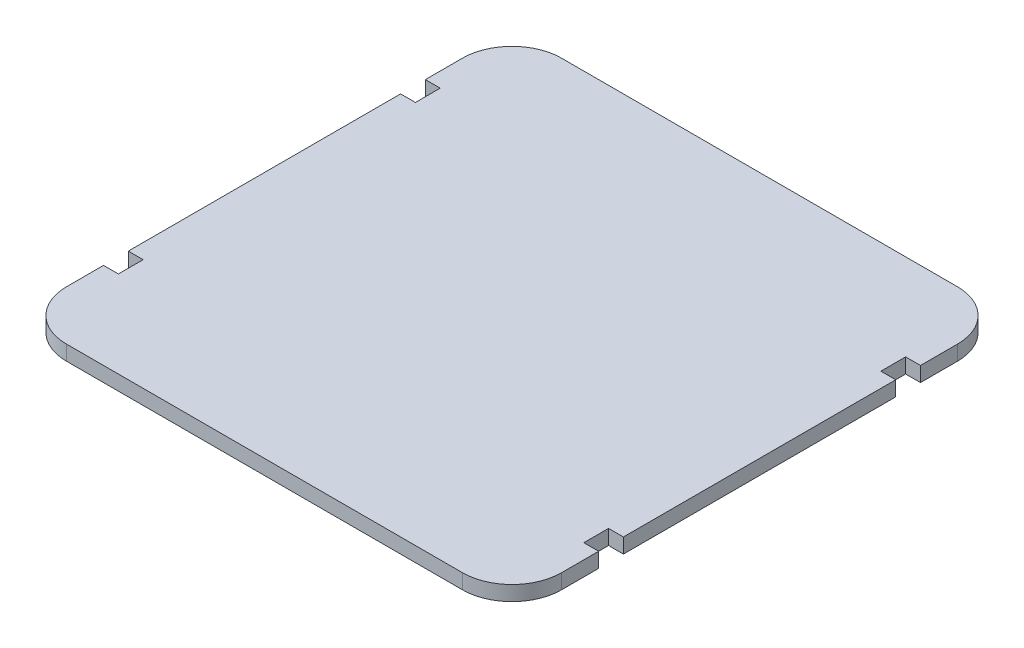
ISO-10303-21;
HEADER;
FILE_DESCRIPTION(('STEP AP214'),'2;1');
FILE_NAME('part.step','',(''),(''),'','','');
FILE_SCHEMA(('AUTOMOTIVE_DESIGN { 1 0 10303 214 1 1 1 1 }'));
ENDSEC;
DATA;
#1=APPLICATION_CONTEXT('core data for automotive mechanical design processes');
#2=APPLICATION_PROTOCOL_DEFINITION('international standard','automotive_design',2000,#1);
#3=PRODUCT_CONTEXT('',#1,'mechanical');
#4=PRODUCT('Part','Part','',(#3));
#5=PRODUCT_RELATED_PRODUCT_CATEGORY('part','',(#4));
#6=PRODUCT_DEFINITION_FORMATION('','',#4);
#7=PRODUCT_DEFINITION_CONTEXT('part definition',#1,'design');
#8=PRODUCT_DEFINITION('design','',#6,#7);
#9=PRODUCT_DEFINITION_SHAPE('','',#8);
#10=(LENGTH_UNIT() NAMED_UNIT(*) SI_UNIT(.MILLI.,.METRE.));
#11=(NAMED_UNIT(*) PLANE_ANGLE_UNIT() SI_UNIT($,.RADIAN.));
#12=(NAMED_UNIT(*) SI_UNIT($,.STERADIAN.) SOLID_ANGLE_UNIT());
#13=UNCERTAINTY_MEASURE_WITH_UNIT(LENGTH_MEASURE(1.E-05),#10,'distance_accuracy_value','');
#14=(GEOMETRIC_REPRESENTATION_CONTEXT(3) GLOBAL_UNCERTAINTY_ASSIGNED_CONTEXT((#13)) GLOBAL_UNIT_ASSIGNED_CONTEXT((#10,
#11,#12)) REPRESENTATION_CONTEXT('',''));
#15=CARTESIAN_POINT('',(0.,0.,0.));
#16=DIRECTION('',(0.,0.,1.));
#17=DIRECTION('',(1.,0.,0.));
#18=AXIS2_PLACEMENT_3D('',#15,#16,#17);
#19=CARTESIAN_POINT('',(127.,7.62,127.));
#20=DIRECTION('',(-1.,0.,0.));
#21=DIRECTION('',(0.,0.,1.));
#22=AXIS2_PLACEMENT_3D('',#19,#20,#21);
#23=PLANE('',#22);
#24=DIRECTION('',(0.,1.,0.));
#25=VECTOR('',#24,1.);
#26=CARTESIAN_POINT('',(127.,0.,82.55));
#27=LINE('',#26,#25);
#28=CARTESIAN_POINT('',(127.,0.,82.55));
#29=VERTEX_POINT('',#28);
#30=CARTESIAN_POINT('',(127.,7.62,82.55));
#31=VERTEX_POINT('',#30);
#32=EDGE_CURVE('E294',#29,#31,#27,.T.);
#33=ORIENTED_EDGE('',*,*,#32,.T.);
#34=DIRECTION('',(0.,0.,-1.));
#35=VECTOR('',#34,1.);
#36=CARTESIAN_POINT('',(127.,7.62,127.));
#37=LINE('',#36,#35);
#38=CARTESIAN_POINT('',(127.,7.62,101.6));
#39=VERTEX_POINT('',#38);
#40=EDGE_CURVE('E293',#39,#31,#37,.T.);
#41=ORIENTED_EDGE('',*,*,#40,.F.);
#42=DIRECTION('',(0.,-1.,0.));
#43=VECTOR('',#42,1.);
#44=CARTESIAN_POINT('',(127.,7.62,101.6));
#45=LINE('',#44,#43);
#46=CARTESIAN_POINT('',(127.,0.,101.6));
#47=VERTEX_POINT('',#46);
#48=EDGE_CURVE('E266',#39,#47,#45,.T.);
#49=ORIENTED_EDGE('',*,*,#48,.T.);
#50=DIRECTION('',(0.,0.,-1.));
#51=VECTOR('',#50,1.);
#52=CARTESIAN_POINT('',(127.,0.,127.));
#53=LINE('',#52,#51);
#54=EDGE_CURVE('E216',#47,#29,#53,.T.);
#55=ORIENTED_EDGE('',*,*,#54,.T.);
#56=EDGE_LOOP('',(#33,#41,#49,#55));
#57=FACE_BOUND('',#56,.T.);
#58=ADVANCED_FACE('F33',(#57),#23,.F.);
#59=DIRECTION('',(0.,1.,0.));
#60=VECTOR('',#59,1.);
#61=CARTESIAN_POINT('',(127.,0.,69.85));
#62=LINE('',#61,#60);
#63=CARTESIAN_POINT('',(127.,0.,69.85));
#64=VERTEX_POINT('',#63);
#65=CARTESIAN_POINT('',(127.,7.62,69.85));
#66=VERTEX_POINT('',#65);
#67=EDGE_CURVE('E194',#64,#66,#62,.T.);
#68=ORIENTED_EDGE('',*,*,#67,.F.);
#69=CARTESIAN_POINT('',(127.,0.,-69.85));
#70=VERTEX_POINT('',#69);
#71=EDGE_CURVE('E206',#64,#70,#53,.T.);
#72=ORIENTED_EDGE('',*,*,#71,.T.);
#73=DIRECTION('',(0.,1.,0.));
#74=VECTOR('',#73,1.);
#75=CARTESIAN_POINT('',(127.,0.,-69.85));
#76=LINE('',#75,#74);
#77=CARTESIAN_POINT('',(127.,7.62,-69.85));
#78=VERTEX_POINT('',#77);
#79=EDGE_CURVE('E452',#70,#78,#76,.T.);
#80=ORIENTED_EDGE('',*,*,#79,.T.);
#81=EDGE_CURVE('E208',#66,#78,#37,.T.);
#82=ORIENTED_EDGE('',*,*,#81,.F.);
#83=EDGE_LOOP('',(#68,#72,#80,#82));
#84=FACE_BOUND('',#83,.T.);
#85=ADVANCED_FACE('F204',(#84),#23,.F.);
#86=CARTESIAN_POINT('',(0.,7.62,0.));
#87=DIRECTION('',(0.,-1.,0.));
#88=DIRECTION('',(0.,0.,-1.));
#89=AXIS2_PLACEMENT_3D('',#86,#87,#88);
#90=PLANE('',#89);
#91=DIRECTION('',(-1.,0.,0.));
#92=VECTOR('',#91,1.);
#93=CARTESIAN_POINT('',(119.38,7.62,82.55));
#94=LINE('',#93,#92);
#95=CARTESIAN_POINT('',(119.38,7.62,82.55));
#96=VERTEX_POINT('',#95);
#97=EDGE_CURVE('E200',#31,#96,#94,.T.);
#98=ORIENTED_EDGE('',*,*,#97,.T.);
#99=DIRECTION('',(0.,0.,-1.));
#100=VECTOR('',#99,1.);
#101=CARTESIAN_POINT('',(119.38,7.62,69.85));
#102=LINE('',#101,#100);
#103=CARTESIAN_POINT('',(119.38,7.62,69.85));
#104=VERTEX_POINT('',#103);
#105=EDGE_CURVE('E431',#96,#104,#102,.T.);
#106=ORIENTED_EDGE('',*,*,#105,.T.);
#107=DIRECTION('',(1.,0.,0.));
#108=VECTOR('',#107,1.);
#109=CARTESIAN_POINT('',(119.38,7.62,69.85));
#110=LINE('',#109,#108);
#111=EDGE_CURVE('E433',#104,#66,#110,.T.);
#112=ORIENTED_EDGE('',*,*,#111,.T.);
#113=ORIENTED_EDGE('',*,*,#81,.T.);
#114=DIRECTION('',(1.,0.,0.));
#115=VECTOR('',#114,1.);
#116=CARTESIAN_POINT('',(119.38,7.62,-69.85));
#117=LINE('',#116,#115);
#118=CARTESIAN_POINT('',(119.38,7.62,-69.85));
#119=VERTEX_POINT('',#118);
#120=EDGE_CURVE('E442',#119,#78,#117,.T.);
#121=ORIENTED_EDGE('',*,*,#120,.F.);
#122=DIRECTION('',(0.,0.,1.));
#123=VECTOR('',#122,1.);
#124=CARTESIAN_POINT('',(119.38,7.62,-69.85));
#125=LINE('',#124,#123);
#126=CARTESIAN_POINT('',(119.38,7.62,-82.55));
#127=VERTEX_POINT('',#126);
#128=EDGE_CURVE('E447',#127,#119,#125,.T.);
#129=ORIENTED_EDGE('',*,*,#128,.F.);
#130=DIRECTION('',(-1.,0.,0.));
#131=VECTOR('',#130,1.);
#132=CARTESIAN_POINT('',(119.38,7.62,-82.55));
#133=LINE('',#132,#131);
#134=CARTESIAN_POINT('',(127.,7.62,-82.55));
#135=VERTEX_POINT('',#134);
#136=EDGE_CURVE('E310',#135,#127,#133,.T.);
#137=ORIENTED_EDGE('',*,*,#136,.F.);
#138=CARTESIAN_POINT('',(127.,7.62,-101.6));
#139=VERTEX_POINT('',#138);
#140=EDGE_CURVE('E236',#135,#139,#37,.T.);
#141=ORIENTED_EDGE('',*,*,#140,.T.);
#142=CARTESIAN_POINT('',(101.6,7.62,-101.6));
#143=DIRECTION('',(0.,-1.,0.));
#144=DIRECTION('',(0.,0.,-1.));
#145=AXIS2_PLACEMENT_3D('',#142,#143,#144);
#146=CIRCLE('',#145,25.4);
#147=CARTESIAN_POINT('',(101.6,7.62,-127.));
#148=VERTEX_POINT('',#147);
#149=EDGE_CURVE('E262',#139,#148,#146,.F.);
#150=ORIENTED_EDGE('',*,*,#149,.T.);
#151=DIRECTION('',(-1.,0.,0.));
#152=VECTOR('',#151,1.);
#153=CARTESIAN_POINT('',(-127.,7.62,-127.));
#154=LINE('',#153,#152);
#155=CARTESIAN_POINT('',(-101.6,7.62,-127.));
#156=VERTEX_POINT('',#155);
#157=EDGE_CURVE('E297',#148,#156,#154,.T.);
#158=ORIENTED_EDGE('',*,*,#157,.T.);
#159=CARTESIAN_POINT('',(-101.6,7.62,-101.6));
#160=DIRECTION('',(0.,-1.,0.));
#161=DIRECTION('',(0.,0.,-1.));
#162=AXIS2_PLACEMENT_3D('',#159,#160,#161);
#163=CIRCLE('',#162,25.4);
#164=CARTESIAN_POINT('',(-127.,7.62,-101.6));
#165=VERTEX_POINT('',#164);
#166=EDGE_CURVE('E264',#156,#165,#163,.F.);
#167=ORIENTED_EDGE('',*,*,#166,.T.);
#168=DIRECTION('',(0.,0.,1.));
#169=VECTOR('',#168,1.);
#170=CARTESIAN_POINT('',(-127.,7.62,127.));
#171=LINE('',#170,#169);
#172=CARTESIAN_POINT('',(-127.,7.62,-82.55));
#173=VERTEX_POINT('',#172);
#174=EDGE_CURVE('E333',#165,#173,#171,.T.);
#175=ORIENTED_EDGE('',*,*,#174,.T.);
#176=DIRECTION('',(1.,0.,0.));
#177=VECTOR('',#176,1.);
#178=CARTESIAN_POINT('',(-119.38,7.62,-82.55));
#179=LINE('',#178,#177);
#180=CARTESIAN_POINT('',(-119.38,7.62,-82.55));
#181=VERTEX_POINT('',#180);
#182=EDGE_CURVE('E463',#173,#181,#179,.T.);
#183=ORIENTED_EDGE('',*,*,#182,.T.);
#184=DIRECTION('',(0.,0.,1.));
#185=VECTOR('',#184,1.);
#186=CARTESIAN_POINT('',(-119.38,7.62,-69.85));
#187=LINE('',#186,#185);
#188=CARTESIAN_POINT('',(-119.38,7.62,-69.85));
#189=VERTEX_POINT('',#188);
#190=EDGE_CURVE('E471',#181,#189,#187,.T.);
#191=ORIENTED_EDGE('',*,*,#190,.T.);
#192=DIRECTION('',(-1.,0.,0.));
#193=VECTOR('',#192,1.);
#194=CARTESIAN_POINT('',(-119.38,7.62,-69.85));
#195=LINE('',#194,#193);
#196=CARTESIAN_POINT('',(-127.,7.62,-69.85));
#197=VERTEX_POINT('',#196);
#198=EDGE_CURVE('E454',#189,#197,#195,.T.);
#199=ORIENTED_EDGE('',*,*,#198,.T.);
#200=CARTESIAN_POINT('',(-127.,7.62,69.85));
#201=VERTEX_POINT('',#200);
#202=EDGE_CURVE('E336',#197,#201,#171,.T.);
#203=ORIENTED_EDGE('',*,*,#202,.T.);
#204=DIRECTION('',(-1.,0.,0.));
#205=VECTOR('',#204,1.);
#206=CARTESIAN_POINT('',(-119.38,7.62,69.85));
#207=LINE('',#206,#205);
#208=CARTESIAN_POINT('',(-119.38,7.62,69.85));
#209=VERTEX_POINT('',#208);
#210=EDGE_CURVE('E485',#209,#201,#207,.T.);
#211=ORIENTED_EDGE('',*,*,#210,.F.);
#212=DIRECTION('',(0.,0.,-1.));
#213=VECTOR('',#212,1.);
#214=CARTESIAN_POINT('',(-119.38,7.62,69.85));
#215=LINE('',#214,#213);
#216=CARTESIAN_POINT('',(-119.38,7.62,82.55));
#217=VERTEX_POINT('',#216);
#218=EDGE_CURVE('E493',#217,#209,#215,.T.);
#219=ORIENTED_EDGE('',*,*,#218,.F.);
#220=DIRECTION('',(1.,0.,0.));
#221=VECTOR('',#220,1.);
#222=CARTESIAN_POINT('',(-119.38,7.62,82.55));
#223=LINE('',#222,#221);
#224=CARTESIAN_POINT('',(-127.,7.62,82.55));
#225=VERTEX_POINT('',#224);
#226=EDGE_CURVE('E341',#225,#217,#223,.T.);
#227=ORIENTED_EDGE('',*,*,#226,.F.);
#228=CARTESIAN_POINT('',(-127.,7.62,101.6));
#229=VERTEX_POINT('',#228);
#230=EDGE_CURVE('E300',#225,#229,#171,.T.);
#231=ORIENTED_EDGE('',*,*,#230,.T.);
#232=CARTESIAN_POINT('',(-101.6,7.62,101.6));
#233=DIRECTION('',(0.,-1.,0.));
#234=DIRECTION('',(0.,0.,-1.));
#235=AXIS2_PLACEMENT_3D('',#232,#233,#234);
#236=CIRCLE('',#235,25.4);
#237=CARTESIAN_POINT('',(-101.6,7.62,127.));
#238=VERTEX_POINT('',#237);
#239=EDGE_CURVE('E258',#229,#238,#236,.F.);
#240=ORIENTED_EDGE('',*,*,#239,.T.);
#241=DIRECTION('',(1.,0.,0.));
#242=VECTOR('',#241,1.);
#243=CARTESIAN_POINT('',(-127.,7.62,127.));
#244=LINE('',#243,#242);
#245=CARTESIAN_POINT('',(101.6,7.62,127.));
#246=VERTEX_POINT('',#245);
#247=EDGE_CURVE('E224',#238,#246,#244,.T.);
#248=ORIENTED_EDGE('',*,*,#247,.T.);
#249=CARTESIAN_POINT('',(101.6,7.62,101.6));
#250=DIRECTION('',(0.,-1.,0.));
#251=DIRECTION('',(0.,0.,-1.));
#252=AXIS2_PLACEMENT_3D('',#249,#250,#251);
#253=CIRCLE('',#252,25.4);
#254=EDGE_CURVE('E260',#246,#39,#253,.F.);
#255=ORIENTED_EDGE('',*,*,#254,.T.);
#256=ORIENTED_EDGE('',*,*,#40,.T.);
#257=EDGE_LOOP('',(#98,#106,#112,#113,#121,#129,#137,#141,#150,#158,#167,#175,#183,#191,#199,
#203,#211,#219,#227,#231,#240,#248,#255,#256));
#258=FACE_BOUND('',#257,.T.);
#259=ADVANCED_FACE('F305',(#258),#90,.F.);
#260=CARTESIAN_POINT('',(0.,0.,0.));
#261=DIRECTION('',(0.,-1.,0.));
#262=DIRECTION('',(0.,0.,-1.));
#263=AXIS2_PLACEMENT_3D('',#260,#261,#262);
#264=PLANE('',#263);
#265=DIRECTION('',(0.,0.,-1.));
#266=VECTOR('',#265,1.);
#267=CARTESIAN_POINT('',(119.38,0.,69.85));
#268=LINE('',#267,#266);
#269=CARTESIAN_POINT('',(119.38,0.,82.55));
#270=VERTEX_POINT('',#269);
#271=CARTESIAN_POINT('',(119.38,0.,69.85));
#272=VERTEX_POINT('',#271);
#273=EDGE_CURVE('E199',#270,#272,#268,.T.);
#274=ORIENTED_EDGE('',*,*,#273,.F.);
#275=DIRECTION('',(-1.,0.,0.));
#276=VECTOR('',#275,1.);
#277=CARTESIAN_POINT('',(119.38,0.,82.55));
#278=LINE('',#277,#276);
#279=EDGE_CURVE('E209',#29,#270,#278,.T.);
#280=ORIENTED_EDGE('',*,*,#279,.F.);
#281=ORIENTED_EDGE('',*,*,#54,.F.);
#282=CARTESIAN_POINT('',(101.6,0.,101.6));
#283=DIRECTION('',(0.,-1.,0.));
#284=DIRECTION('',(0.,0.,-1.));
#285=AXIS2_PLACEMENT_3D('',#282,#283,#284);
#286=CIRCLE('',#285,25.4);
#287=CARTESIAN_POINT('',(101.6,0.,127.));
#288=VERTEX_POINT('',#287);
#289=EDGE_CURVE('E246',#47,#288,#286,.T.);
#290=ORIENTED_EDGE('',*,*,#289,.T.);
#291=DIRECTION('',(1.,0.,0.));
#292=VECTOR('',#291,1.);
#293=CARTESIAN_POINT('',(-127.,0.,127.));
#294=LINE('',#293,#292);
#295=CARTESIAN_POINT('',(-101.6,0.,127.));
#296=VERTEX_POINT('',#295);
#297=EDGE_CURVE('E232',#296,#288,#294,.T.);
#298=ORIENTED_EDGE('',*,*,#297,.F.);
#299=CARTESIAN_POINT('',(-101.6,0.,101.6));
#300=DIRECTION('',(0.,-1.,0.));
#301=DIRECTION('',(0.,0.,-1.));
#302=AXIS2_PLACEMENT_3D('',#299,#300,#301);
#303=CIRCLE('',#302,25.4);
#304=CARTESIAN_POINT('',(-127.,0.,101.6));
#305=VERTEX_POINT('',#304);
#306=EDGE_CURVE('E243',#296,#305,#303,.T.);
#307=ORIENTED_EDGE('',*,*,#306,.T.);
#308=DIRECTION('',(0.,0.,1.));
#309=VECTOR('',#308,1.);
#310=CARTESIAN_POINT('',(-127.,0.,127.));
#311=LINE('',#310,#309);
#312=CARTESIAN_POINT('',(-127.,0.,82.55));
#313=VERTEX_POINT('',#312);
#314=EDGE_CURVE('E228',#313,#305,#311,.T.);
#315=ORIENTED_EDGE('',*,*,#314,.F.);
#316=DIRECTION('',(1.,0.,0.));
#317=VECTOR('',#316,1.);
#318=CARTESIAN_POINT('',(-119.38,0.,82.55));
#319=LINE('',#318,#317);
#320=CARTESIAN_POINT('',(-119.38,0.,82.55));
#321=VERTEX_POINT('',#320);
#322=EDGE_CURVE('E481',#313,#321,#319,.T.);
#323=ORIENTED_EDGE('',*,*,#322,.T.);
#324=DIRECTION('',(0.,0.,-1.));
#325=VECTOR('',#324,1.);
#326=CARTESIAN_POINT('',(-119.38,0.,69.85));
#327=LINE('',#326,#325);
#328=CARTESIAN_POINT('',(-119.38,0.,69.85));
#329=VERTEX_POINT('',#328);
#330=EDGE_CURVE('E484',#321,#329,#327,.T.);
#331=ORIENTED_EDGE('',*,*,#330,.T.);
#332=DIRECTION('',(-1.,0.,0.));
#333=VECTOR('',#332,1.);
#334=CARTESIAN_POINT('',(-119.38,0.,69.85));
#335=LINE('',#334,#333);
#336=CARTESIAN_POINT('',(-127.,0.,69.85));
#337=VERTEX_POINT('',#336);
#338=EDGE_CURVE('E488',#329,#337,#335,.T.);
#339=ORIENTED_EDGE('',*,*,#338,.T.);
#340=CARTESIAN_POINT('',(-127.,0.,-69.85));
#341=VERTEX_POINT('',#340);
#342=EDGE_CURVE('E233',#341,#337,#311,.T.);
#343=ORIENTED_EDGE('',*,*,#342,.F.);
#344=DIRECTION('',(-1.,0.,0.));
#345=VECTOR('',#344,1.);
#346=CARTESIAN_POINT('',(-119.38,0.,-69.85));
#347=LINE('',#346,#345);
#348=CARTESIAN_POINT('',(-119.38,0.,-69.85));
#349=VERTEX_POINT('',#348);
#350=EDGE_CURVE('E460',#349,#341,#347,.T.);
#351=ORIENTED_EDGE('',*,*,#350,.F.);
#352=DIRECTION('',(0.,0.,1.));
#353=VECTOR('',#352,1.);
#354=CARTESIAN_POINT('',(-119.38,0.,-69.85));
#355=LINE('',#354,#353);
#356=CARTESIAN_POINT('',(-119.38,0.,-82.55));
#357=VERTEX_POINT('',#356);
#358=EDGE_CURVE('E462',#357,#349,#355,.T.);
#359=ORIENTED_EDGE('',*,*,#358,.F.);
#360=DIRECTION('',(1.,0.,0.));
#361=VECTOR('',#360,1.);
#362=CARTESIAN_POINT('',(-119.38,0.,-82.55));
#363=LINE('',#362,#361);
#364=CARTESIAN_POINT('',(-127.,0.,-82.55));
#365=VERTEX_POINT('',#364);
#366=EDGE_CURVE('E466',#365,#357,#363,.T.);
#367=ORIENTED_EDGE('',*,*,#366,.F.);
#368=CARTESIAN_POINT('',(-127.,0.,-101.6));
#369=VERTEX_POINT('',#368);
#370=EDGE_CURVE('E229',#369,#365,#311,.T.);
#371=ORIENTED_EDGE('',*,*,#370,.F.);
#372=CARTESIAN_POINT('',(-101.6,0.,-101.6));
#373=DIRECTION('',(0.,-1.,0.));
#374=DIRECTION('',(0.,0.,-1.));
#375=AXIS2_PLACEMENT_3D('',#372,#373,#374);
#376=CIRCLE('',#375,25.4);
#377=CARTESIAN_POINT('',(-101.6,0.,-127.));
#378=VERTEX_POINT('',#377);
#379=EDGE_CURVE('E251',#369,#378,#376,.T.);
#380=ORIENTED_EDGE('',*,*,#379,.T.);
#381=DIRECTION('',(-1.,0.,0.));
#382=VECTOR('',#381,1.);
#383=CARTESIAN_POINT('',(-127.,0.,-127.));
#384=LINE('',#383,#382);
#385=CARTESIAN_POINT('',(101.6,0.,-127.));
#386=VERTEX_POINT('',#385);
#387=EDGE_CURVE('E220',#386,#378,#384,.T.);
#388=ORIENTED_EDGE('',*,*,#387,.F.);
#389=CARTESIAN_POINT('',(101.6,0.,-101.6));
#390=DIRECTION('',(0.,-1.,0.));
#391=DIRECTION('',(0.,0.,-1.));
#392=AXIS2_PLACEMENT_3D('',#389,#390,#391);
#393=CIRCLE('',#392,25.4);
#394=CARTESIAN_POINT('',(127.,0.,-101.6));
#395=VERTEX_POINT('',#394);
#396=EDGE_CURVE('E248',#386,#395,#393,.T.);
#397=ORIENTED_EDGE('',*,*,#396,.T.);
#398=CARTESIAN_POINT('',(127.,0.,-82.55));
#399=VERTEX_POINT('',#398);
#400=EDGE_CURVE('E217',#399,#395,#53,.T.);
#401=ORIENTED_EDGE('',*,*,#400,.F.);
#402=DIRECTION('',(-1.,0.,0.));
#403=VECTOR('',#402,1.);
#404=CARTESIAN_POINT('',(119.38,0.,-82.55));
#405=LINE('',#404,#403);
#406=CARTESIAN_POINT('',(119.38,0.,-82.55));
#407=VERTEX_POINT('',#406);
#408=EDGE_CURVE('E56',#399,#407,#405,.T.);
#409=ORIENTED_EDGE('',*,*,#408,.T.);
#410=DIRECTION('',(0.,0.,1.));
#411=VECTOR('',#410,1.);
#412=CARTESIAN_POINT('',(119.38,0.,-69.85));
#413=LINE('',#412,#411);
#414=CARTESIAN_POINT('',(119.38,0.,-69.85));
#415=VERTEX_POINT('',#414);
#416=EDGE_CURVE('E441',#407,#415,#413,.T.);
#417=ORIENTED_EDGE('',*,*,#416,.T.);
#418=DIRECTION('',(1.,0.,0.));
#419=VECTOR('',#418,1.);
#420=CARTESIAN_POINT('',(119.38,0.,-69.85));
#421=LINE('',#420,#419);
#422=EDGE_CURVE('E215',#415,#70,#421,.T.);
#423=ORIENTED_EDGE('',*,*,#422,.T.);
#424=ORIENTED_EDGE('',*,*,#71,.F.);
#425=DIRECTION('',(1.,0.,0.));
#426=VECTOR('',#425,1.);
#427=CARTESIAN_POINT('',(119.38,0.,69.85));
#428=LINE('',#427,#426);
#429=EDGE_CURVE('E191',#272,#64,#428,.T.);
#430=ORIENTED_EDGE('',*,*,#429,.F.);
#431=EDGE_LOOP('',(#274,#280,#281,#290,#298,#307,#315,#323,#331,#339,#343,#351,#359,#367,#371,
#380,#388,#397,#401,#409,#417,#423,#424,#430));
#432=FACE_BOUND('',#431,.T.);
#433=ADVANCED_FACE('F212',(#432),#264,.T.);
#434=CARTESIAN_POINT('',(-127.,7.62,127.));
#435=DIRECTION('',(1.,0.,0.));
#436=DIRECTION('',(0.,0.,-1.));
#437=AXIS2_PLACEMENT_3D('',#434,#435,#436);
#438=PLANE('',#437);
#439=DIRECTION('',(0.,1.,0.));
#440=VECTOR('',#439,1.);
#441=CARTESIAN_POINT('',(-127.,0.,-82.55));
#442=LINE('',#441,#440);
#443=EDGE_CURVE('E334',#365,#173,#442,.T.);
#444=ORIENTED_EDGE('',*,*,#443,.T.);
#445=ORIENTED_EDGE('',*,*,#174,.F.);
#446=DIRECTION('',(0.,-1.,0.));
#447=VECTOR('',#446,1.);
#448=CARTESIAN_POINT('',(-127.,7.62,-101.6));
#449=LINE('',#448,#447);
#450=EDGE_CURVE('E240',#165,#369,#449,.T.);
#451=ORIENTED_EDGE('',*,*,#450,.T.);
#452=ORIENTED_EDGE('',*,*,#370,.T.);
#453=EDGE_LOOP('',(#444,#445,#451,#452));
#454=FACE_BOUND('',#453,.T.);
#455=ADVANCED_FACE('F331',(#454),#438,.F.);
#456=DIRECTION('',(0.,1.,0.));
#457=VECTOR('',#456,1.);
#458=CARTESIAN_POINT('',(-127.,0.,-69.85));
#459=LINE('',#458,#457);
#460=EDGE_CURVE('E468',#341,#197,#459,.T.);
#461=ORIENTED_EDGE('',*,*,#460,.F.);
#462=ORIENTED_EDGE('',*,*,#342,.T.);
#463=DIRECTION('',(0.,1.,0.));
#464=VECTOR('',#463,1.);
#465=CARTESIAN_POINT('',(-127.,0.,69.85));
#466=LINE('',#465,#464);
#467=EDGE_CURVE('E221',#337,#201,#466,.T.);
#468=ORIENTED_EDGE('',*,*,#467,.T.);
#469=ORIENTED_EDGE('',*,*,#202,.F.);
#470=EDGE_LOOP('',(#461,#462,#468,#469));
#471=FACE_BOUND('',#470,.T.);
#472=ADVANCED_FACE('F362',(#471),#438,.F.);
#473=ORIENTED_EDGE('',*,*,#140,.F.);
#474=DIRECTION('',(0.,1.,0.));
#475=VECTOR('',#474,1.);
#476=CARTESIAN_POINT('',(127.,0.,-82.55));
#477=LINE('',#476,#475);
#478=EDGE_CURVE('E445',#399,#135,#477,.T.);
#479=ORIENTED_EDGE('',*,*,#478,.F.);
#480=ORIENTED_EDGE('',*,*,#400,.T.);
#481=DIRECTION('',(0.,-1.,0.));
#482=VECTOR('',#481,1.);
#483=CARTESIAN_POINT('',(127.,7.62,-101.6));
#484=LINE('',#483,#482);
#485=EDGE_CURVE('E269',#395,#139,#484,.F.);
#486=ORIENTED_EDGE('',*,*,#485,.T.);
#487=EDGE_LOOP('',(#473,#479,#480,#486));
#488=FACE_BOUND('',#487,.T.);
#489=ADVANCED_FACE('F313',(#488),#23,.F.);
#490=CARTESIAN_POINT('',(-127.,7.62,-127.));
#491=DIRECTION('',(0.,0.,1.));
#492=DIRECTION('',(1.,0.,0.));
#493=AXIS2_PLACEMENT_3D('',#490,#491,#492);
#494=PLANE('',#493);
#495=ORIENTED_EDGE('',*,*,#387,.T.);
#496=DIRECTION('',(0.,-1.,0.));
#497=VECTOR('',#496,1.);
#498=CARTESIAN_POINT('',(-101.6,7.62,-127.));
#499=LINE('',#498,#497);
#500=EDGE_CURVE('E256',#378,#156,#499,.F.);
#501=ORIENTED_EDGE('',*,*,#500,.T.);
#502=ORIENTED_EDGE('',*,*,#157,.F.);
#503=DIRECTION('',(0.,-1.,0.));
#504=VECTOR('',#503,1.);
#505=CARTESIAN_POINT('',(101.6,7.62,-127.));
#506=LINE('',#505,#504);
#507=EDGE_CURVE('E253',#148,#386,#506,.T.);
#508=ORIENTED_EDGE('',*,*,#507,.T.);
#509=EDGE_LOOP('',(#495,#501,#502,#508));
#510=FACE_BOUND('',#509,.T.);
#511=ADVANCED_FACE('F320',(#510),#494,.F.);
#512=ORIENTED_EDGE('',*,*,#230,.F.);
#513=DIRECTION('',(0.,1.,0.));
#514=VECTOR('',#513,1.);
#515=CARTESIAN_POINT('',(-127.,0.,82.55));
#516=LINE('',#515,#514);
#517=EDGE_CURVE('E491',#313,#225,#516,.T.);
#518=ORIENTED_EDGE('',*,*,#517,.F.);
#519=ORIENTED_EDGE('',*,*,#314,.T.);
#520=DIRECTION('',(0.,-1.,0.));
#521=VECTOR('',#520,1.);
#522=CARTESIAN_POINT('',(-127.,7.62,101.6));
#523=LINE('',#522,#521);
#524=EDGE_CURVE('E237',#305,#229,#523,.F.);
#525=ORIENTED_EDGE('',*,*,#524,.T.);
#526=EDGE_LOOP('',(#512,#518,#519,#525));
#527=FACE_BOUND('',#526,.T.);
#528=ADVANCED_FACE('F344',(#527),#438,.F.);
#529=CARTESIAN_POINT('',(-127.,7.62,127.));
#530=DIRECTION('',(0.,0.,-1.));
#531=DIRECTION('',(-1.,0.,0.));
#532=AXIS2_PLACEMENT_3D('',#529,#530,#531);
#533=PLANE('',#532);
#534=ORIENTED_EDGE('',*,*,#297,.T.);
#535=DIRECTION('',(0.,-1.,0.));
#536=VECTOR('',#535,1.);
#537=CARTESIAN_POINT('',(101.6,7.62,127.));
#538=LINE('',#537,#536);
#539=EDGE_CURVE('E11',#288,#246,#538,.F.);
#540=ORIENTED_EDGE('',*,*,#539,.T.);
#541=ORIENTED_EDGE('',*,*,#247,.F.);
#542=DIRECTION('',(0.,-1.,0.));
#543=VECTOR('',#542,1.);
#544=CARTESIAN_POINT('',(-101.6,7.62,127.));
#545=LINE('',#544,#543);
#546=EDGE_CURVE('E41',#238,#296,#545,.T.);
#547=ORIENTED_EDGE('',*,*,#546,.T.);
#548=EDGE_LOOP('',(#534,#540,#541,#547));
#549=FACE_BOUND('',#548,.T.);
#550=ADVANCED_FACE('F276',(#549),#533,.F.);
#551=CARTESIAN_POINT('',(-101.6,7.62,-101.6));
#552=DIRECTION('',(0.,-1.,0.));
#553=DIRECTION('',(0.,0.,-1.));
#554=AXIS2_PLACEMENT_3D('',#551,#552,#553);
#555=CYLINDRICAL_SURFACE('',#554,25.4);
#556=ORIENTED_EDGE('',*,*,#166,.F.);
#557=ORIENTED_EDGE('',*,*,#500,.F.);
#558=ORIENTED_EDGE('',*,*,#379,.F.);
#559=ORIENTED_EDGE('',*,*,#450,.F.);
#560=EDGE_LOOP('',(#556,#557,#558,#559));
#561=FACE_BOUND('',#560,.T.);
#562=ADVANCED_FACE('F327',(#561),#555,.T.);
#563=CARTESIAN_POINT('',(101.6,7.62,-101.6));
#564=DIRECTION('',(0.,-1.,0.));
#565=DIRECTION('',(0.,0.,-1.));
#566=AXIS2_PLACEMENT_3D('',#563,#564,#565);
#567=CYLINDRICAL_SURFACE('',#566,25.4);
#568=ORIENTED_EDGE('',*,*,#149,.F.);
#569=ORIENTED_EDGE('',*,*,#485,.F.);
#570=ORIENTED_EDGE('',*,*,#396,.F.);
#571=ORIENTED_EDGE('',*,*,#507,.F.);
#572=EDGE_LOOP('',(#568,#569,#570,#571));
#573=FACE_BOUND('',#572,.T.);
#574=ADVANCED_FACE('F317',(#573),#567,.T.);
#575=CARTESIAN_POINT('',(101.6,7.62,101.6));
#576=DIRECTION('',(0.,-1.,0.));
#577=DIRECTION('',(0.,0.,-1.));
#578=AXIS2_PLACEMENT_3D('',#575,#576,#577);
#579=CYLINDRICAL_SURFACE('',#578,25.4);
#580=ORIENTED_EDGE('',*,*,#254,.F.);
#581=ORIENTED_EDGE('',*,*,#539,.F.);
#582=ORIENTED_EDGE('',*,*,#289,.F.);
#583=ORIENTED_EDGE('',*,*,#48,.F.);
#584=EDGE_LOOP('',(#580,#581,#582,#583));
#585=FACE_BOUND('',#584,.T.);
#586=ADVANCED_FACE('F288',(#585),#579,.T.);
#587=CARTESIAN_POINT('',(-101.6,7.62,101.6));
#588=DIRECTION('',(0.,-1.,0.));
#589=DIRECTION('',(0.,0.,-1.));
#590=AXIS2_PLACEMENT_3D('',#587,#588,#589);
#591=CYLINDRICAL_SURFACE('',#590,25.4);
#592=ORIENTED_EDGE('',*,*,#239,.F.);
#593=ORIENTED_EDGE('',*,*,#524,.F.);
#594=ORIENTED_EDGE('',*,*,#306,.F.);
#595=ORIENTED_EDGE('',*,*,#546,.F.);
#596=EDGE_LOOP('',(#592,#593,#594,#595));
#597=FACE_BOUND('',#596,.T.);
#598=ADVANCED_FACE('F35',(#597),#591,.T.);
#599=CARTESIAN_POINT('',(-119.38,0.,69.85));
#600=DIRECTION('',(0.,0.,-1.));
#601=DIRECTION('',(-1.,0.,0.));
#602=AXIS2_PLACEMENT_3D('',#599,#600,#601);
#603=PLANE('',#602);
#604=ORIENTED_EDGE('',*,*,#210,.T.);
#605=ORIENTED_EDGE('',*,*,#467,.F.);
#606=ORIENTED_EDGE('',*,*,#338,.F.);
#607=DIRECTION('',(0.,1.,0.));
#608=VECTOR('',#607,1.);
#609=CARTESIAN_POINT('',(-119.38,0.,69.85));
#610=LINE('',#609,#608);
#611=EDGE_CURVE('E500',#329,#209,#610,.T.);
#612=ORIENTED_EDGE('',*,*,#611,.T.);
#613=EDGE_LOOP('',(#604,#605,#606,#612));
#614=FACE_BOUND('',#613,.T.);
#615=ADVANCED_FACE('F346',(#614),#603,.F.);
#616=CARTESIAN_POINT('',(-119.38,0.,69.85));
#617=DIRECTION('',(1.,0.,0.));
#618=DIRECTION('',(0.,0.,-1.));
#619=AXIS2_PLACEMENT_3D('',#616,#617,#618);
#620=PLANE('',#619);
#621=ORIENTED_EDGE('',*,*,#218,.T.);
#622=ORIENTED_EDGE('',*,*,#611,.F.);
#623=ORIENTED_EDGE('',*,*,#330,.F.);
#624=DIRECTION('',(0.,1.,0.));
#625=VECTOR('',#624,1.);
#626=CARTESIAN_POINT('',(-119.38,0.,82.55));
#627=LINE('',#626,#625);
#628=EDGE_CURVE('E502',#321,#217,#627,.T.);
#629=ORIENTED_EDGE('',*,*,#628,.T.);
#630=EDGE_LOOP('',(#621,#622,#623,#629));
#631=FACE_BOUND('',#630,.T.);
#632=ADVANCED_FACE('F351',(#631),#620,.F.);
#633=CARTESIAN_POINT('',(-119.38,0.,82.55));
#634=DIRECTION('',(0.,0.,1.));
#635=DIRECTION('',(1.,0.,0.));
#636=AXIS2_PLACEMENT_3D('',#633,#634,#635);
#637=PLANE('',#636);
#638=ORIENTED_EDGE('',*,*,#226,.T.);
#639=ORIENTED_EDGE('',*,*,#628,.F.);
#640=ORIENTED_EDGE('',*,*,#322,.F.);
#641=ORIENTED_EDGE('',*,*,#517,.T.);
#642=EDGE_LOOP('',(#638,#639,#640,#641));
#643=FACE_BOUND('',#642,.T.);
#644=ADVANCED_FACE('F386',(#643),#637,.F.);
#645=CARTESIAN_POINT('',(-119.38,0.,-82.55));
#646=DIRECTION('',(0.,0.,1.));
#647=DIRECTION('',(1.,0.,0.));
#648=AXIS2_PLACEMENT_3D('',#645,#646,#647);
#649=PLANE('',#648);
#650=ORIENTED_EDGE('',*,*,#182,.F.);
#651=ORIENTED_EDGE('',*,*,#443,.F.);
#652=ORIENTED_EDGE('',*,*,#366,.T.);
#653=DIRECTION('',(0.,1.,0.));
#654=VECTOR('',#653,1.);
#655=CARTESIAN_POINT('',(-119.38,0.,-82.55));
#656=LINE('',#655,#654);
#657=EDGE_CURVE('E476',#357,#181,#656,.T.);
#658=ORIENTED_EDGE('',*,*,#657,.T.);
#659=EDGE_LOOP('',(#650,#651,#652,#658));
#660=FACE_BOUND('',#659,.T.);
#661=ADVANCED_FACE('F389',(#660),#649,.T.);
#662=CARTESIAN_POINT('',(-119.38,0.,-69.85));
#663=DIRECTION('',(-1.,0.,0.));
#664=DIRECTION('',(0.,0.,1.));
#665=AXIS2_PLACEMENT_3D('',#662,#663,#664);
#666=PLANE('',#665);
#667=ORIENTED_EDGE('',*,*,#190,.F.);
#668=ORIENTED_EDGE('',*,*,#657,.F.);
#669=ORIENTED_EDGE('',*,*,#358,.T.);
#670=DIRECTION('',(0.,1.,0.));
#671=VECTOR('',#670,1.);
#672=CARTESIAN_POINT('',(-119.38,0.,-69.85));
#673=LINE('',#672,#671);
#674=EDGE_CURVE('E478',#349,#189,#673,.T.);
#675=ORIENTED_EDGE('',*,*,#674,.T.);
#676=EDGE_LOOP('',(#667,#668,#669,#675));
#677=FACE_BOUND('',#676,.T.);
#678=ADVANCED_FACE('F398',(#677),#666,.T.);
#679=CARTESIAN_POINT('',(-119.38,0.,-69.85));
#680=DIRECTION('',(0.,0.,-1.));
#681=DIRECTION('',(-1.,0.,0.));
#682=AXIS2_PLACEMENT_3D('',#679,#680,#681);
#683=PLANE('',#682);
#684=ORIENTED_EDGE('',*,*,#198,.F.);
#685=ORIENTED_EDGE('',*,*,#674,.F.);
#686=ORIENTED_EDGE('',*,*,#350,.T.);
#687=ORIENTED_EDGE('',*,*,#460,.T.);
#688=EDGE_LOOP('',(#684,#685,#686,#687));
#689=FACE_BOUND('',#688,.T.);
#690=ADVANCED_FACE('F394',(#689),#683,.T.);
#691=CARTESIAN_POINT('',(119.38,0.,-69.85));
#692=DIRECTION('',(0.,0.,1.));
#693=DIRECTION('',(1.,0.,0.));
#694=AXIS2_PLACEMENT_3D('',#691,#692,#693);
#695=PLANE('',#694);
#696=ORIENTED_EDGE('',*,*,#120,.T.);
#697=ORIENTED_EDGE('',*,*,#79,.F.);
#698=ORIENTED_EDGE('',*,*,#422,.F.);
#699=DIRECTION('',(0.,1.,0.));
#700=VECTOR('',#699,1.);
#701=CARTESIAN_POINT('',(119.38,0.,-69.85));
#702=LINE('',#701,#700);
#703=EDGE_CURVE('E455',#415,#119,#702,.T.);
#704=ORIENTED_EDGE('',*,*,#703,.T.);
#705=EDGE_LOOP('',(#696,#697,#698,#704));
#706=FACE_BOUND('',#705,.T.);
#707=ADVANCED_FACE('F397',(#706),#695,.F.);
#708=CARTESIAN_POINT('',(119.38,0.,-69.85));
#709=DIRECTION('',(-1.,0.,0.));
#710=DIRECTION('',(0.,0.,1.));
#711=AXIS2_PLACEMENT_3D('',#708,#709,#710);
#712=PLANE('',#711);
#713=ORIENTED_EDGE('',*,*,#128,.T.);
#714=ORIENTED_EDGE('',*,*,#703,.F.);
#715=ORIENTED_EDGE('',*,*,#416,.F.);
#716=DIRECTION('',(0.,1.,0.));
#717=VECTOR('',#716,1.);
#718=CARTESIAN_POINT('',(119.38,0.,-82.55));
#719=LINE('',#718,#717);
#720=EDGE_CURVE('E457',#407,#127,#719,.T.);
#721=ORIENTED_EDGE('',*,*,#720,.T.);
#722=EDGE_LOOP('',(#713,#714,#715,#721));
#723=FACE_BOUND('',#722,.T.);
#724=ADVANCED_FACE('F410',(#723),#712,.F.);
#725=CARTESIAN_POINT('',(119.38,0.,-82.55));
#726=DIRECTION('',(0.,0.,-1.));
#727=DIRECTION('',(-1.,0.,0.));
#728=AXIS2_PLACEMENT_3D('',#725,#726,#727);
#729=PLANE('',#728);
#730=ORIENTED_EDGE('',*,*,#136,.T.);
#731=ORIENTED_EDGE('',*,*,#720,.F.);
#732=ORIENTED_EDGE('',*,*,#408,.F.);
#733=ORIENTED_EDGE('',*,*,#478,.T.);
#734=EDGE_LOOP('',(#730,#731,#732,#733));
#735=FACE_BOUND('',#734,.T.);
#736=ADVANCED_FACE('F406',(#735),#729,.F.);
#737=CARTESIAN_POINT('',(119.38,0.,82.55));
#738=DIRECTION('',(0.,0.,-1.));
#739=DIRECTION('',(-1.,0.,0.));
#740=AXIS2_PLACEMENT_3D('',#737,#738,#739);
#741=PLANE('',#740);
#742=ORIENTED_EDGE('',*,*,#97,.F.);
#743=ORIENTED_EDGE('',*,*,#32,.F.);
#744=ORIENTED_EDGE('',*,*,#279,.T.);
#745=DIRECTION('',(0.,1.,0.));
#746=VECTOR('',#745,1.);
#747=CARTESIAN_POINT('',(119.38,0.,82.55));
#748=LINE('',#747,#746);
#749=EDGE_CURVE('E428',#270,#96,#748,.T.);
#750=ORIENTED_EDGE('',*,*,#749,.T.);
#751=EDGE_LOOP('',(#742,#743,#744,#750));
#752=FACE_BOUND('',#751,.T.);
#753=ADVANCED_FACE('F409',(#752),#741,.T.);
#754=CARTESIAN_POINT('',(119.38,0.,69.85));
#755=DIRECTION('',(1.,0.,0.));
#756=DIRECTION('',(0.,0.,-1.));
#757=AXIS2_PLACEMENT_3D('',#754,#755,#756);
#758=PLANE('',#757);
#759=ORIENTED_EDGE('',*,*,#105,.F.);
#760=ORIENTED_EDGE('',*,*,#749,.F.);
#761=ORIENTED_EDGE('',*,*,#273,.T.);
#762=DIRECTION('',(0.,1.,0.));
#763=VECTOR('',#762,1.);
#764=CARTESIAN_POINT('',(119.38,0.,69.85));
#765=LINE('',#764,#763);
#766=EDGE_CURVE('E48',#272,#104,#765,.T.);
#767=ORIENTED_EDGE('',*,*,#766,.T.);
#768=EDGE_LOOP('',(#759,#760,#761,#767));
#769=FACE_BOUND('',#768,.T.);
#770=ADVANCED_FACE('F419',(#769),#758,.T.);
#771=CARTESIAN_POINT('',(119.38,0.,69.85));
#772=DIRECTION('',(0.,0.,1.));
#773=DIRECTION('',(1.,0.,0.));
#774=AXIS2_PLACEMENT_3D('',#771,#772,#773);
#775=PLANE('',#774);
#776=ORIENTED_EDGE('',*,*,#111,.F.);
#777=ORIENTED_EDGE('',*,*,#766,.F.);
#778=ORIENTED_EDGE('',*,*,#429,.T.);
#779=ORIENTED_EDGE('',*,*,#67,.T.);
#780=EDGE_LOOP('',(#776,#777,#778,#779));
#781=FACE_BOUND('',#780,.T.);
#782=ADVANCED_FACE('F193',(#781),#775,.T.);
#783=CLOSED_SHELL('',(#58,#85,#259,#433,#455,#472,#489,#511,#528,#550,#562,#574,#586,#598,#615,
#632,#644,#661,#678,#690,#707,#724,#736,#753,#770,#782));
#784=MANIFOLD_SOLID_BREP('B2',#783);
#785=ADVANCED_BREP_SHAPE_REPRESENTATION('',(#18,#784),#14);
#786=SHAPE_DEFINITION_REPRESENTATION(#9,#785);
ENDSEC;
END-ISO-10303-21;
